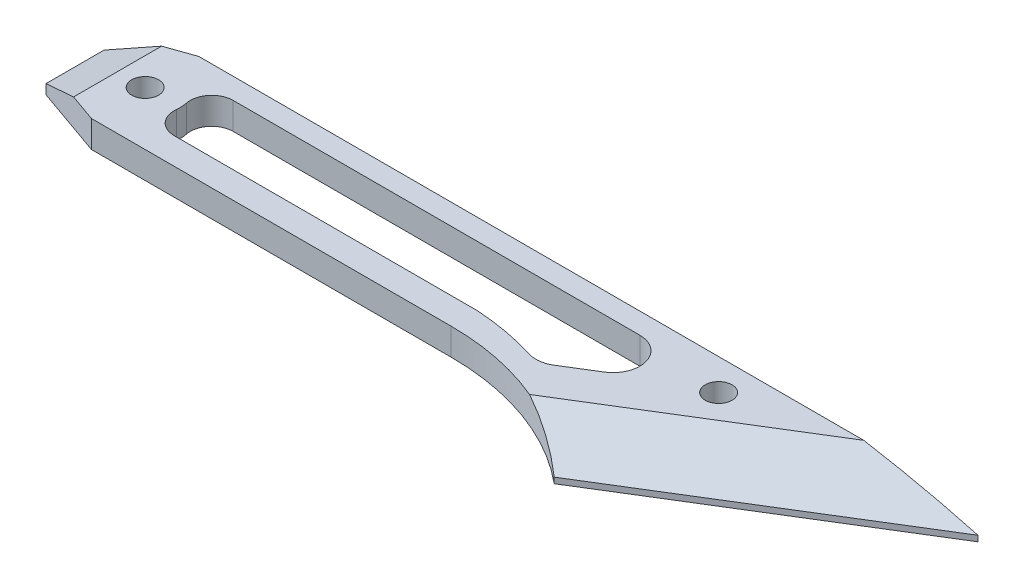
ISO-10303-21;
HEADER;
FILE_DESCRIPTION(('STEP AP214'),'2;1');
FILE_NAME('part.step','',(''),(''),'','','');
FILE_SCHEMA(('AUTOMOTIVE_DESIGN { 1 0 10303 214 1 1 1 1 }'));
ENDSEC;
DATA;
#1=APPLICATION_CONTEXT('core data for automotive mechanical design processes');
#2=APPLICATION_PROTOCOL_DEFINITION('international standard','automotive_design',2000,#1);
#3=PRODUCT_CONTEXT('',#1,'mechanical');
#4=PRODUCT('Part','Part','',(#3));
#5=PRODUCT_RELATED_PRODUCT_CATEGORY('part','',(#4));
#6=PRODUCT_DEFINITION_FORMATION('','',#4);
#7=PRODUCT_DEFINITION_CONTEXT('part definition',#1,'design');
#8=PRODUCT_DEFINITION('design','',#6,#7);
#9=PRODUCT_DEFINITION_SHAPE('','',#8);
#10=(LENGTH_UNIT() NAMED_UNIT(*) SI_UNIT(.MILLI.,.METRE.));
#11=(NAMED_UNIT(*) PLANE_ANGLE_UNIT() SI_UNIT($,.RADIAN.));
#12=(NAMED_UNIT(*) SI_UNIT($,.STERADIAN.) SOLID_ANGLE_UNIT());
#13=UNCERTAINTY_MEASURE_WITH_UNIT(LENGTH_MEASURE(1.E-05),#10,'distance_accuracy_value','');
#14=(GEOMETRIC_REPRESENTATION_CONTEXT(3) GLOBAL_UNCERTAINTY_ASSIGNED_CONTEXT((#13)) GLOBAL_UNIT_ASSIGNED_CONTEXT((#10,
#11,#12)) REPRESENTATION_CONTEXT('',''));
#15=CARTESIAN_POINT('',(0.,0.,0.));
#16=DIRECTION('',(0.,0.,1.));
#17=DIRECTION('',(1.,0.,0.));
#18=AXIS2_PLACEMENT_3D('',#15,#16,#17);
#19=CARTESIAN_POINT('',(50.8,0.,32.8083333333334));
#20=DIRECTION('',(0.,-1.,0.));
#21=DIRECTION('',(0.,0.,-1.));
#22=AXIS2_PLACEMENT_3D('',#19,#20,#21);
#23=PLANE('',#22);
#24=CARTESIAN_POINT('',(8.28992983067394,0.,-3.429));
#25=DIRECTION('',(0.,1.,0.));
#26=DIRECTION('',(0.,0.,1.));
#27=AXIS2_PLACEMENT_3D('',#24,#25,#26);
#28=CIRCLE('',#27,1.5875);
#29=CARTESIAN_POINT('',(8.28992983067394,0.,-1.8415));
#30=VERTEX_POINT('',#29);
#31=EDGE_CURVE('E178',#30,#30,#28,.T.);
#32=ORIENTED_EDGE('',*,*,#31,.T.);
#33=EDGE_LOOP('',(#32));
#34=FACE_BOUND('',#33,.T.);
#35=CARTESIAN_POINT('',(8.28992983067394,0.,-3.429));
#36=DIRECTION('',(0.,-1.,0.));
#37=DIRECTION('',(0.,0.,-1.));
#38=AXIS2_PLACEMENT_3D('',#35,#36,#37);
#39=CIRCLE('',#38,4.1275);
#40=CARTESIAN_POINT('',(12.333339272969,0.,-4.25791274085937));
#41=VERTEX_POINT('',#40);
#42=CARTESIAN_POINT('',(12.3962691287879,0.,-3.01158675300746));
#43=VERTEX_POINT('',#42);
#44=EDGE_CURVE('E211',#41,#43,#39,.T.);
#45=ORIENTED_EDGE('',*,*,#44,.T.);
#46=CARTESIAN_POINT('',(14.9232471583965,0.,-2.75471706255051));
#47=DIRECTION('',(0.,-1.,0.));
#48=DIRECTION('',(0.,0.,-1.));
#49=AXIS2_PLACEMENT_3D('',#46,#47,#48);
#50=CIRCLE('',#49,2.54);
#51=CARTESIAN_POINT('',(14.9232471583965,0.,-0.214717062550514));
#52=VERTEX_POINT('',#51);
#53=EDGE_CURVE('E236',#43,#52,#50,.F.);
#54=ORIENTED_EDGE('',*,*,#53,.T.);
#55=DIRECTION('',(1.,0.,0.));
#56=VECTOR('',#55,1.);
#57=CARTESIAN_POINT('',(14.9232471583965,0.,-0.214717062550514));
#58=LINE('',#57,#56);
#59=CARTESIAN_POINT('',(50.8010780015129,0.,-0.214717062550514));
#60=VERTEX_POINT('',#59);
#61=EDGE_CURVE('E195',#52,#60,#58,.T.);
#62=ORIENTED_EDGE('',*,*,#61,.T.);
#63=CARTESIAN_POINT('',(48.6883260508946,0.,32.330206500448));
#64=DIRECTION('',(0.,-1.,0.));
#65=DIRECTION('',(0.,0.,-1.));
#66=AXIS2_PLACEMENT_3D('',#63,#64,#65);
#67=CIRCLE('',#66,32.6134292972429);
#68=CARTESIAN_POINT('',(58.2813161500645,0.,1.15954222322276));
#69=VERTEX_POINT('',#68);
#70=EDGE_CURVE('E200',#60,#69,#67,.T.);
#71=ORIENTED_EDGE('',*,*,#70,.T.);
#72=CARTESIAN_POINT('',(59.21521804941,0.,-1.875000945427));
#73=DIRECTION('',(0.,-1.,0.));
#74=DIRECTION('',(0.,0.,-1.));
#75=AXIS2_PLACEMENT_3D('',#72,#73,#74);
#76=CIRCLE('',#75,3.175);
#77=CARTESIAN_POINT('',(60.8804338210623,0.,0.828271411151344));
#78=VERTEX_POINT('',#77);
#79=EDGE_CURVE('E322',#69,#78,#76,.F.);
#80=ORIENTED_EDGE('',*,*,#79,.T.);
#81=DIRECTION('',(0.85142436427664,0.,-0.524477408394412));
#82=VECTOR('',#81,1.);
#83=CARTESIAN_POINT('',(59.62129677767,0.,1.60389982988099));
#84=LINE('',#83,#82);
#85=CARTESIAN_POINT('',(64.5460376256946,0.,-1.42974053250218));
#86=VERTEX_POINT('',#85);
#87=EDGE_CURVE('E203',#78,#86,#84,.T.);
#88=ORIENTED_EDGE('',*,*,#87,.T.);
#89=CARTESIAN_POINT('',(62.8808218540424,0.,-4.13301288908052));
#90=DIRECTION('',(0.,-1.,0.));
#91=DIRECTION('',(0.,0.,-1.));
#92=AXIS2_PLACEMENT_3D('',#89,#90,#91);
#93=CIRCLE('',#92,3.175);
#94=CARTESIAN_POINT('',(62.8808218540424,0.,-7.30801288908052));
#95=VERTEX_POINT('',#94);
#96=EDGE_CURVE('E49',#86,#95,#93,.F.);
#97=ORIENTED_EDGE('',*,*,#96,.T.);
#98=DIRECTION('',(-1.,0.,0.));
#99=VECTOR('',#98,1.);
#100=CARTESIAN_POINT('',(74.0886875552049,0.,-7.30801288908052));
#101=LINE('',#100,#99);
#102=CARTESIAN_POINT('',(14.8215912374583,0.,-7.30801288908052));
#103=VERTEX_POINT('',#102);
#104=EDGE_CURVE('E206',#95,#103,#101,.T.);
#105=ORIENTED_EDGE('',*,*,#104,.T.);
#106=CARTESIAN_POINT('',(14.8215912374583,0.,-4.76801288908052));
#107=DIRECTION('',(0.,-1.,0.));
#108=DIRECTION('',(0.,0.,-1.));
#109=AXIS2_PLACEMENT_3D('',#106,#107,#108);
#110=CIRCLE('',#109,2.54);
#111=EDGE_CURVE('E208',#103,#41,#110,.F.);
#112=ORIENTED_EDGE('',*,*,#111,.T.);
#113=EDGE_LOOP('',(#45,#54,#62,#71,#80,#88,#97,#105,#112));
#114=FACE_BOUND('',#113,.T.);
#115=CARTESIAN_POINT('',(73.406,0.,-6.096));
#116=DIRECTION('',(0.,1.,0.));
#117=DIRECTION('',(0.,0.,1.));
#118=AXIS2_PLACEMENT_3D('',#115,#116,#117);
#119=CIRCLE('',#118,1.5875);
#120=CARTESIAN_POINT('',(73.406,0.,-4.5085));
#121=VERTEX_POINT('',#120);
#122=EDGE_CURVE('E192',#121,#121,#119,.T.);
#123=ORIENTED_EDGE('',*,*,#122,.T.);
#124=EDGE_LOOP('',(#123));
#125=FACE_BOUND('',#124,.T.);
#126=DIRECTION('',(-1.,0.,0.));
#127=VECTOR('',#126,1.);
#128=CARTESIAN_POINT('',(8.28992983067394,0.,-9.779));
#129=LINE('',#128,#127);
#130=CARTESIAN_POINT('',(86.8714609375993,0.,-9.779));
#131=VERTEX_POINT('',#130);
#132=CARTESIAN_POINT('',(8.28992983067394,0.,-9.779));
#133=VERTEX_POINT('',#132);
#134=EDGE_CURVE('E280',#131,#133,#129,.T.);
#135=ORIENTED_EDGE('',*,*,#134,.F.);
#136=CARTESIAN_POINT('',(86.8714609375993,0.,199.785908128836));
#137=DIRECTION('',(0.,-1.,0.));
#138=DIRECTION('',(0.,0.,-1.));
#139=AXIS2_PLACEMENT_3D('',#136,#137,#138);
#140=CIRCLE('',#139,209.564908128836);
#141=CARTESIAN_POINT('',(100.843083740158,0.,-9.31273958393734));
#142=VERTEX_POINT('',#141);
#143=EDGE_CURVE('E56',#131,#142,#140,.T.);
#144=ORIENTED_EDGE('',*,*,#143,.T.);
#145=DIRECTION('',(0.85142436427664,0.,-0.524477408394413));
#146=VECTOR('',#145,1.);
#147=CARTESIAN_POINT('',(69.85,0.,9.77900000000004));
#148=LINE('',#147,#146);
#149=CARTESIAN_POINT('',(69.85,0.,9.77900000000004));
#150=VERTEX_POINT('',#149);
#151=EDGE_CURVE('E184',#150,#142,#148,.T.);
#152=ORIENTED_EDGE('',*,*,#151,.F.);
#153=CARTESIAN_POINT('',(50.8,0.,32.8083333333334));
#154=DIRECTION('',(0.,-1.,0.));
#155=DIRECTION('',(0.,0.,-1.));
#156=AXIS2_PLACEMENT_3D('',#153,#154,#155);
#157=CIRCLE('',#156,29.8873333333334);
#158=CARTESIAN_POINT('',(50.8,0.,2.92100000000003));
#159=VERTEX_POINT('',#158);
#160=EDGE_CURVE('E276',#159,#150,#157,.T.);
#161=ORIENTED_EDGE('',*,*,#160,.F.);
#162=DIRECTION('',(1.,0.,0.));
#163=VECTOR('',#162,1.);
#164=CARTESIAN_POINT('',(50.8,0.,2.92100000000003));
#165=LINE('',#164,#163);
#166=CARTESIAN_POINT('',(8.28992983067394,0.,2.921));
#167=VERTEX_POINT('',#166);
#168=EDGE_CURVE('E274',#167,#159,#165,.T.);
#169=ORIENTED_EDGE('',*,*,#168,.F.);
#170=DIRECTION('',(0.943163655254947,0.,0.332328631637613));
#171=VECTOR('',#170,1.);
#172=CARTESIAN_POINT('',(0.,0.,0.));
#173=LINE('',#172,#171);
#174=CARTESIAN_POINT('',(0.,0.,0.));
#175=VERTEX_POINT('',#174);
#176=EDGE_CURVE('E255',#175,#167,#173,.T.);
#177=ORIENTED_EDGE('',*,*,#176,.F.);
#178=DIRECTION('',(0.,0.,1.));
#179=VECTOR('',#178,1.);
#180=CARTESIAN_POINT('',(0.,0.,0.));
#181=LINE('',#180,#179);
#182=CARTESIAN_POINT('',(0.,0.,-6.858));
#183=VERTEX_POINT('',#182);
#184=EDGE_CURVE('E261',#183,#175,#181,.T.);
#185=ORIENTED_EDGE('',*,*,#184,.F.);
#186=DIRECTION('',(-0.943163655254947,0.,0.332328631637613));
#187=VECTOR('',#186,1.);
#188=CARTESIAN_POINT('',(0.,0.,-6.858));
#189=LINE('',#188,#187);
#190=EDGE_CURVE('E282',#133,#183,#189,.T.);
#191=ORIENTED_EDGE('',*,*,#190,.F.);
#192=EDGE_LOOP('',(#135,#144,#152,#161,#169,#177,#185,#191));
#193=FACE_BOUND('',#192,.T.);
#194=ADVANCED_FACE('F41',(#34,#114,#125,#193),#23,.T.);
#195=CARTESIAN_POINT('',(69.85,3.175,9.77900000000004));
#196=DIRECTION('',(-0.524477408394413,0.,-0.85142436427664));
#197=DIRECTION('',(-0.85142436427664,0.,0.524477408394413));
#198=AXIS2_PLACEMENT_3D('',#195,#196,#197);
#199=PLANE('',#198);
#200=DIRECTION('',(0.,-1.,0.));
#201=VECTOR('',#200,1.);
#202=CARTESIAN_POINT('',(100.843083740158,132.567547052805,-9.31273958393736));
#203=LINE('',#202,#201);
#204=CARTESIAN_POINT('',(100.843083740158,0.675804530419932,-9.31273958393736));
#205=VERTEX_POINT('',#204);
#206=EDGE_CURVE('E182',#205,#142,#203,.T.);
#207=ORIENTED_EDGE('',*,*,#206,.F.);
#208=DIRECTION('',(-0.85142436427664,0.,0.524477408394413));
#209=VECTOR('',#208,1.);
#210=CARTESIAN_POINT('',(69.85,0.675804530419943,9.77900000000004));
#211=LINE('',#210,#209);
#212=CARTESIAN_POINT('',(69.85,0.675804530419946,9.77900000000004));
#213=VERTEX_POINT('',#212);
#214=EDGE_CURVE('E170',#205,#213,#211,.T.);
#215=ORIENTED_EDGE('',*,*,#214,.T.);
#216=DIRECTION('',(0.,-1.,0.));
#217=VECTOR('',#216,1.);
#218=CARTESIAN_POINT('',(69.85,3.175,9.77900000000004));
#219=LINE('',#218,#217);
#220=EDGE_CURVE('E293',#213,#150,#219,.T.);
#221=ORIENTED_EDGE('',*,*,#220,.T.);
#222=ORIENTED_EDGE('',*,*,#151,.T.);
#223=EDGE_LOOP('',(#207,#215,#221,#222));
#224=FACE_BOUND('',#223,.T.);
#225=ADVANCED_FACE('F183',(#224),#199,.F.);
#226=CARTESIAN_POINT('',(65.7985242599529,3.175,3.20192899343016));
#227=DIRECTION('',(-0.161444785545511,-0.951444518554411,-0.262085690820633));
#228=DIRECTION('',(0.,0.265569498876491,-0.964091718285397));
#229=AXIS2_PLACEMENT_3D('',#226,#227,#228);
#230=PLANE('',#229);
#231=CARTESIAN_POINT('',(86.8714609375993,-54.5519222194457,199.785908128836));
#232=DIRECTION('',(-0.161444785545511,-0.951444518554411,-0.262085690820633));
#233=DIRECTION('',(0.499011155322487,-0.307820285414663,0.810083044354683));
#234=AXIS2_PLACEMENT_3D('',#231,#232,#233);
#235=ELLIPSE('',#234,220.259725125371,209.564908128836);
#236=CARTESIAN_POINT('',(86.8714609375993,3.17499999999999,-9.77900000000002));
#237=VERTEX_POINT('',#236);
#238=EDGE_CURVE('E13',#237,#205,#235,.T.);
#239=ORIENTED_EDGE('',*,*,#238,.F.);
#240=DIRECTION('',(0.85142436427664,0.,-0.524477408394413));
#241=VECTOR('',#240,1.);
#242=CARTESIAN_POINT('',(65.7985242599529,3.175,3.20192899343016));
#243=LINE('',#242,#241);
#244=CARTESIAN_POINT('',(62.43031779899,3.175,5.27674417338337));
#245=VERTEX_POINT('',#244);
#246=EDGE_CURVE('E179',#245,#237,#243,.T.);
#247=ORIENTED_EDGE('',*,*,#246,.F.);
#248=CARTESIAN_POINT('',(50.8,-2.43539692530007,32.8083333333334));
#249=DIRECTION('',(-0.161444785545511,-0.951444518554411,-0.262085690820633));
#250=DIRECTION('',(0.499011155322489,-0.307820285414663,0.810083044354683));
#251=AXIS2_PLACEMENT_3D('',#248,#249,#250);
#252=ELLIPSE('',#251,31.4125865991041,29.8873333333334);
#253=EDGE_CURVE('E175',#245,#213,#252,.T.);
#254=ORIENTED_EDGE('',*,*,#253,.T.);
#255=ORIENTED_EDGE('',*,*,#214,.F.);
#256=EDGE_LOOP('',(#239,#247,#254,#255));
#257=FACE_BOUND('',#256,.T.);
#258=ADVANCED_FACE('F172',(#257),#230,.F.);
#259=CARTESIAN_POINT('',(50.8,3.175,32.8083333333334));
#260=DIRECTION('',(0.,-1.,0.));
#261=DIRECTION('',(0.,0.,-1.));
#262=AXIS2_PLACEMENT_3D('',#259,#260,#261);
#263=PLANE('',#262);
#264=CARTESIAN_POINT('',(73.406,3.175,-6.096));
#265=DIRECTION('',(0.,1.,0.));
#266=DIRECTION('',(0.,0.,1.));
#267=AXIS2_PLACEMENT_3D('',#264,#265,#266);
#268=CIRCLE('',#267,1.5875);
#269=CARTESIAN_POINT('',(73.406,3.175,-4.5085));
#270=VERTEX_POINT('',#269);
#271=EDGE_CURVE('E191',#270,#270,#268,.T.);
#272=ORIENTED_EDGE('',*,*,#271,.F.);
#273=EDGE_LOOP('',(#272));
#274=FACE_BOUND('',#273,.T.);
#275=CARTESIAN_POINT('',(14.9232471583965,3.175,-2.75471706255051));
#276=DIRECTION('',(0.,1.,0.));
#277=DIRECTION('',(0.,0.,1.));
#278=AXIS2_PLACEMENT_3D('',#275,#276,#277);
#279=CIRCLE('',#278,2.54);
#280=CARTESIAN_POINT('',(12.3962691287879,3.175,-3.01158675300746));
#281=VERTEX_POINT('',#280);
#282=CARTESIAN_POINT('',(14.9232471583965,3.175,-0.214717062550514));
#283=VERTEX_POINT('',#282);
#284=EDGE_CURVE('E216',#281,#283,#279,.T.);
#285=ORIENTED_EDGE('',*,*,#284,.F.);
#286=CARTESIAN_POINT('',(8.28992983067394,3.175,-3.429));
#287=DIRECTION('',(0.,-1.,0.));
#288=DIRECTION('',(0.,0.,1.));
#289=AXIS2_PLACEMENT_3D('',#286,#287,#288);
#290=CIRCLE('',#289,4.1275);
#291=CARTESIAN_POINT('',(12.333339272969,3.175,-4.25791274085937));
#292=VERTEX_POINT('',#291);
#293=EDGE_CURVE('E214',#292,#281,#290,.T.);
#294=ORIENTED_EDGE('',*,*,#293,.F.);
#295=CARTESIAN_POINT('',(14.8215912374583,3.175,-4.76801288908052));
#296=DIRECTION('',(0.,1.,0.));
#297=DIRECTION('',(0.,0.,-1.));
#298=AXIS2_PLACEMENT_3D('',#295,#296,#297);
#299=CIRCLE('',#298,2.54);
#300=CARTESIAN_POINT('',(14.8215912374583,3.175,-7.30801288908052));
#301=VERTEX_POINT('',#300);
#302=EDGE_CURVE('E230',#301,#292,#299,.T.);
#303=ORIENTED_EDGE('',*,*,#302,.F.);
#304=DIRECTION('',(-1.,0.,0.));
#305=VECTOR('',#304,1.);
#306=CARTESIAN_POINT('',(74.0886875552049,3.175,-7.30801288908052));
#307=LINE('',#306,#305);
#308=CARTESIAN_POINT('',(62.8808218540424,3.175,-7.30801288908052));
#309=VERTEX_POINT('',#308);
#310=EDGE_CURVE('E228',#309,#301,#307,.T.);
#311=ORIENTED_EDGE('',*,*,#310,.F.);
#312=CARTESIAN_POINT('',(62.8808218540424,3.175,-4.13301288908052));
#313=DIRECTION('',(0.,-1.,0.));
#314=DIRECTION('',(0.,0.,-1.));
#315=AXIS2_PLACEMENT_3D('',#312,#313,#314);
#316=CIRCLE('',#315,3.175);
#317=CARTESIAN_POINT('',(64.5460376256946,3.175,-1.42974053250218));
#318=VERTEX_POINT('',#317);
#319=EDGE_CURVE('E324',#309,#318,#316,.T.);
#320=ORIENTED_EDGE('',*,*,#319,.T.);
#321=DIRECTION('',(0.85142436427664,0.,-0.524477408394412));
#322=VECTOR('',#321,1.);
#323=CARTESIAN_POINT('',(59.62129677767,3.175,1.60389982988099));
#324=LINE('',#323,#322);
#325=CARTESIAN_POINT('',(60.8804338210623,3.175,0.828271411151344));
#326=VERTEX_POINT('',#325);
#327=EDGE_CURVE('E225',#326,#318,#324,.T.);
#328=ORIENTED_EDGE('',*,*,#327,.F.);
#329=CARTESIAN_POINT('',(59.21521804941,3.175,-1.875000945427));
#330=DIRECTION('',(0.,-1.,0.));
#331=DIRECTION('',(0.,0.,-1.));
#332=AXIS2_PLACEMENT_3D('',#329,#330,#331);
#333=CIRCLE('',#332,3.175);
#334=CARTESIAN_POINT('',(58.2813161500645,3.175,1.15954222322276));
#335=VERTEX_POINT('',#334);
#336=EDGE_CURVE('E320',#326,#335,#333,.T.);
#337=ORIENTED_EDGE('',*,*,#336,.T.);
#338=CARTESIAN_POINT('',(48.6883260508946,3.175,32.330206500448));
#339=DIRECTION('',(0.,-1.,0.));
#340=DIRECTION('',(0.,0.,1.));
#341=AXIS2_PLACEMENT_3D('',#338,#339,#340);
#342=CIRCLE('',#341,32.6134292972429);
#343=CARTESIAN_POINT('',(50.8010780015129,3.175,-0.214717062550523));
#344=VERTEX_POINT('',#343);
#345=EDGE_CURVE('E222',#344,#335,#342,.T.);
#346=ORIENTED_EDGE('',*,*,#345,.F.);
#347=DIRECTION('',(1.,0.,0.));
#348=VECTOR('',#347,1.);
#349=CARTESIAN_POINT('',(14.9232471583965,3.175,-0.214717062550514));
#350=LINE('',#349,#348);
#351=EDGE_CURVE('E219',#283,#344,#350,.T.);
#352=ORIENTED_EDGE('',*,*,#351,.F.);
#353=EDGE_LOOP('',(#285,#294,#303,#311,#320,#328,#337,#346,#352));
#354=FACE_BOUND('',#353,.T.);
#355=CARTESIAN_POINT('',(8.28992983067394,3.175,-3.429));
#356=DIRECTION('',(0.,1.,0.));
#357=DIRECTION('',(0.,0.,1.));
#358=AXIS2_PLACEMENT_3D('',#355,#356,#357);
#359=CIRCLE('',#358,1.5875);
#360=CARTESIAN_POINT('',(8.28992983067394,3.175,-1.8415));
#361=VERTEX_POINT('',#360);
#362=EDGE_CURVE('E252',#361,#361,#359,.T.);
#363=ORIENTED_EDGE('',*,*,#362,.F.);
#364=EDGE_LOOP('',(#363));
#365=FACE_BOUND('',#364,.T.);
#366=CARTESIAN_POINT('',(50.8,3.175,32.8083333333334));
#367=DIRECTION('',(0.,-1.,0.));
#368=DIRECTION('',(0.,0.,-1.));
#369=AXIS2_PLACEMENT_3D('',#366,#367,#368);
#370=CIRCLE('',#369,29.8873333333334);
#371=CARTESIAN_POINT('',(50.8,3.175,2.92100000000003));
#372=VERTEX_POINT('',#371);
#373=EDGE_CURVE('E263',#372,#245,#370,.T.);
#374=ORIENTED_EDGE('',*,*,#373,.T.);
#375=ORIENTED_EDGE('',*,*,#246,.T.);
#376=DIRECTION('',(-1.,0.,0.));
#377=VECTOR('',#376,1.);
#378=CARTESIAN_POINT('',(8.28992983067394,3.175,-9.779));
#379=LINE('',#378,#377);
#380=CARTESIAN_POINT('',(8.28992983067394,3.175,-9.779));
#381=VERTEX_POINT('',#380);
#382=EDGE_CURVE('E266',#237,#381,#379,.T.);
#383=ORIENTED_EDGE('',*,*,#382,.T.);
#384=DIRECTION('',(-0.943163655254947,0.,0.332328631637613));
#385=VECTOR('',#384,1.);
#386=CARTESIAN_POINT('',(0.,3.175,-6.858));
#387=LINE('',#386,#385);
#388=CARTESIAN_POINT('',(5.0293764861419,3.175,-8.63012702834497));
#389=VERTEX_POINT('',#388);
#390=EDGE_CURVE('E268',#381,#389,#387,.T.);
#391=ORIENTED_EDGE('',*,*,#390,.T.);
#392=DIRECTION('',(0.,0.,1.));
#393=VECTOR('',#392,1.);
#394=CARTESIAN_POINT('',(5.02937648614191,3.175,32.8083333333334));
#395=LINE('',#394,#393);
#396=CARTESIAN_POINT('',(5.0293764861419,3.175,1.77212702834496));
#397=VERTEX_POINT('',#396);
#398=EDGE_CURVE('E301',#389,#397,#395,.T.);
#399=ORIENTED_EDGE('',*,*,#398,.T.);
#400=DIRECTION('',(0.943163655254947,0.,0.332328631637613));
#401=VECTOR('',#400,1.);
#402=CARTESIAN_POINT('',(0.,3.175,0.));
#403=LINE('',#402,#401);
#404=CARTESIAN_POINT('',(8.28992983067394,3.175,2.921));
#405=VERTEX_POINT('',#404);
#406=EDGE_CURVE('E258',#397,#405,#403,.T.);
#407=ORIENTED_EDGE('',*,*,#406,.T.);
#408=DIRECTION('',(1.,0.,0.));
#409=VECTOR('',#408,1.);
#410=CARTESIAN_POINT('',(50.8,3.175,2.92100000000003));
#411=LINE('',#410,#409);
#412=EDGE_CURVE('E260',#405,#372,#411,.T.);
#413=ORIENTED_EDGE('',*,*,#412,.T.);
#414=EDGE_LOOP('',(#374,#375,#383,#391,#399,#407,#413));
#415=FACE_BOUND('',#414,.T.);
#416=ADVANCED_FACE('F341',(#274,#354,#365,#415),#263,.F.);
#417=CARTESIAN_POINT('',(50.8,3.175,32.8083333333334));
#418=DIRECTION('',(0.,-1.,0.));
#419=DIRECTION('',(0.,0.,-1.));
#420=AXIS2_PLACEMENT_3D('',#417,#418,#419);
#421=CYLINDRICAL_SURFACE('',#420,29.8873333333334);
#422=ORIENTED_EDGE('',*,*,#220,.F.);
#423=ORIENTED_EDGE('',*,*,#253,.F.);
#424=ORIENTED_EDGE('',*,*,#373,.F.);
#425=DIRECTION('',(0.,-1.,0.));
#426=VECTOR('',#425,1.);
#427=CARTESIAN_POINT('',(50.8,3.175,2.92100000000003));
#428=LINE('',#427,#426);
#429=EDGE_CURVE('E295',#372,#159,#428,.T.);
#430=ORIENTED_EDGE('',*,*,#429,.T.);
#431=ORIENTED_EDGE('',*,*,#160,.T.);
#432=EDGE_LOOP('',(#422,#423,#424,#430,#431));
#433=FACE_BOUND('',#432,.T.);
#434=ADVANCED_FACE('F401',(#433),#421,.F.);
#435=CARTESIAN_POINT('',(0.,3.175,0.));
#436=DIRECTION('',(0.332328631637613,0.,-0.943163655254947));
#437=DIRECTION('',(-0.943163655254947,0.,-0.332328631637613));
#438=AXIS2_PLACEMENT_3D('',#435,#436,#437);
#439=PLANE('',#438);
#440=ORIENTED_EDGE('',*,*,#406,.F.);
#441=DIRECTION('',(0.881342473762532,0.356085473342498,0.310545615999631));
#442=VECTOR('',#441,1.);
#443=CARTESIAN_POINT('',(13.523894328756,6.60700798424077,4.76521468108551));
#444=LINE('',#443,#442);
#445=CARTESIAN_POINT('',(0.,1.14299999999999,0.));
#446=VERTEX_POINT('',#445);
#447=EDGE_CURVE('E304',#397,#446,#444,.F.);
#448=ORIENTED_EDGE('',*,*,#447,.T.);
#449=DIRECTION('',(0.,-1.,0.));
#450=VECTOR('',#449,1.);
#451=CARTESIAN_POINT('',(0.,3.175,0.));
#452=LINE('',#451,#450);
#453=EDGE_CURVE('E271',#446,#175,#452,.T.);
#454=ORIENTED_EDGE('',*,*,#453,.T.);
#455=ORIENTED_EDGE('',*,*,#176,.T.);
#456=DIRECTION('',(0.,-1.,0.));
#457=VECTOR('',#456,1.);
#458=CARTESIAN_POINT('',(8.28992983067394,3.175,2.921));
#459=LINE('',#458,#457);
#460=EDGE_CURVE('E298',#405,#167,#459,.T.);
#461=ORIENTED_EDGE('',*,*,#460,.F.);
#462=EDGE_LOOP('',(#440,#448,#454,#455,#461));
#463=FACE_BOUND('',#462,.T.);
#464=ADVANCED_FACE('F404',(#463),#439,.F.);
#465=CARTESIAN_POINT('',(50.8,3.175,2.92100000000003));
#466=DIRECTION('',(0.,0.,-1.));
#467=DIRECTION('',(-1.,0.,0.));
#468=AXIS2_PLACEMENT_3D('',#465,#466,#467);
#469=PLANE('',#468);
#470=ORIENTED_EDGE('',*,*,#168,.T.);
#471=ORIENTED_EDGE('',*,*,#429,.F.);
#472=ORIENTED_EDGE('',*,*,#412,.F.);
#473=ORIENTED_EDGE('',*,*,#460,.T.);
#474=EDGE_LOOP('',(#470,#471,#472,#473));
#475=FACE_BOUND('',#474,.T.);
#476=ADVANCED_FACE('F399',(#475),#469,.F.);
#477=CARTESIAN_POINT('',(8.28992983067394,3.175,-9.779));
#478=DIRECTION('',(0.,0.,1.));
#479=DIRECTION('',(1.,0.,0.));
#480=AXIS2_PLACEMENT_3D('',#477,#478,#479);
#481=PLANE('',#480);
#482=ORIENTED_EDGE('',*,*,#382,.F.);
#483=DIRECTION('',(0.,-1.,0.));
#484=VECTOR('',#483,1.);
#485=CARTESIAN_POINT('',(86.8714609375993,132.567547052805,-9.77900000000002));
#486=LINE('',#485,#484);
#487=EDGE_CURVE('E64',#237,#131,#486,.T.);
#488=ORIENTED_EDGE('',*,*,#487,.T.);
#489=ORIENTED_EDGE('',*,*,#134,.T.);
#490=DIRECTION('',(0.,-1.,0.));
#491=VECTOR('',#490,1.);
#492=CARTESIAN_POINT('',(8.28992983067394,3.175,-9.779));
#493=LINE('',#492,#491);
#494=EDGE_CURVE('E290',#381,#133,#493,.T.);
#495=ORIENTED_EDGE('',*,*,#494,.F.);
#496=EDGE_LOOP('',(#482,#488,#489,#495));
#497=FACE_BOUND('',#496,.T.);
#498=ADVANCED_FACE('F396',(#497),#481,.F.);
#499=CARTESIAN_POINT('',(0.,3.175,-6.858));
#500=DIRECTION('',(0.332328631637613,0.,0.943163655254947));
#501=DIRECTION('',(0.943163655254947,0.,-0.332328631637613));
#502=AXIS2_PLACEMENT_3D('',#499,#500,#501);
#503=PLANE('',#502);
#504=DIRECTION('',(0.,-1.,0.));
#505=VECTOR('',#504,1.);
#506=CARTESIAN_POINT('',(0.,3.175,-6.858));
#507=LINE('',#506,#505);
#508=CARTESIAN_POINT('',(0.,1.14299999999999,-6.858));
#509=VERTEX_POINT('',#508);
#510=EDGE_CURVE('E288',#509,#183,#507,.T.);
#511=ORIENTED_EDGE('',*,*,#510,.F.);
#512=DIRECTION('',(-0.881342473762532,-0.356085473342498,0.310545615999631));
#513=VECTOR('',#512,1.);
#514=CARTESIAN_POINT('',(-6.31220751590011,-1.40729737933745,-4.63386076956634));
#515=LINE('',#514,#513);
#516=EDGE_CURVE('E308',#509,#389,#515,.F.);
#517=ORIENTED_EDGE('',*,*,#516,.T.);
#518=ORIENTED_EDGE('',*,*,#390,.F.);
#519=ORIENTED_EDGE('',*,*,#494,.T.);
#520=ORIENTED_EDGE('',*,*,#190,.T.);
#521=EDGE_LOOP('',(#511,#517,#518,#519,#520));
#522=FACE_BOUND('',#521,.T.);
#523=ADVANCED_FACE('F392',(#522),#503,.F.);
#524=CARTESIAN_POINT('',(0.,3.175,0.));
#525=DIRECTION('',(1.,0.,0.));
#526=DIRECTION('',(0.,0.,-1.));
#527=AXIS2_PLACEMENT_3D('',#524,#525,#526);
#528=PLANE('',#527);
#529=ORIENTED_EDGE('',*,*,#453,.F.);
#530=DIRECTION('',(0.,0.,-1.));
#531=VECTOR('',#530,1.);
#532=CARTESIAN_POINT('',(0.,1.14299999999999,0.));
#533=LINE('',#532,#531);
#534=EDGE_CURVE('E306',#446,#509,#533,.T.);
#535=ORIENTED_EDGE('',*,*,#534,.T.);
#536=ORIENTED_EDGE('',*,*,#510,.T.);
#537=ORIENTED_EDGE('',*,*,#184,.T.);
#538=EDGE_LOOP('',(#529,#535,#536,#537));
#539=FACE_BOUND('',#538,.T.);
#540=ADVANCED_FACE('F388',(#539),#528,.F.);
#541=CARTESIAN_POINT('',(8.28992983067394,3.175,-3.429));
#542=DIRECTION('',(0.,-1.,0.));
#543=DIRECTION('',(0.,0.,-1.));
#544=AXIS2_PLACEMENT_3D('',#541,#542,#543);
#545=CYLINDRICAL_SURFACE('',#544,1.5875);
#546=ORIENTED_EDGE('',*,*,#362,.T.);
#547=EDGE_LOOP('',(#546));
#548=FACE_BOUND('',#547,.T.);
#549=ORIENTED_EDGE('',*,*,#31,.F.);
#550=EDGE_LOOP('',(#549));
#551=FACE_BOUND('',#550,.T.);
#552=ADVANCED_FACE('F391',(#548,#551),#545,.F.);
#553=CARTESIAN_POINT('',(5.02937648614191,3.175,32.8083333333334));
#554=DIRECTION('',(0.374606593415913,-0.927183854566787,0.));
#555=DIRECTION('',(0.,0.,1.));
#556=AXIS2_PLACEMENT_3D('',#553,#554,#555);
#557=PLANE('',#556);
#558=ORIENTED_EDGE('',*,*,#516,.F.);
#559=ORIENTED_EDGE('',*,*,#534,.F.);
#560=ORIENTED_EDGE('',*,*,#447,.F.);
#561=ORIENTED_EDGE('',*,*,#398,.F.);
#562=EDGE_LOOP('',(#558,#559,#560,#561));
#563=FACE_BOUND('',#562,.T.);
#564=ADVANCED_FACE('F375',(#563),#557,.F.);
#565=CARTESIAN_POINT('',(8.28992983067394,-0.00100000000000013,-3.429));
#566=DIRECTION('',(0.,1.,0.));
#567=DIRECTION('',(0.,0.,1.));
#568=AXIS2_PLACEMENT_3D('',#565,#566,#567);
#569=CYLINDRICAL_SURFACE('',#568,4.1275);
#570=DIRECTION('',(0.,1.,0.));
#571=VECTOR('',#570,1.);
#572=CARTESIAN_POINT('',(12.333339272969,-0.00100000000000013,-4.25791274085937));
#573=LINE('',#572,#571);
#574=EDGE_CURVE('E234',#41,#292,#573,.T.);
#575=ORIENTED_EDGE('',*,*,#574,.T.);
#576=ORIENTED_EDGE('',*,*,#293,.T.);
#577=DIRECTION('',(0.,1.,0.));
#578=VECTOR('',#577,1.);
#579=CARTESIAN_POINT('',(12.3962691287879,-0.00100000000000013,-3.01158675300746));
#580=LINE('',#579,#578);
#581=EDGE_CURVE('E233',#43,#281,#580,.T.);
#582=ORIENTED_EDGE('',*,*,#581,.F.);
#583=ORIENTED_EDGE('',*,*,#44,.F.);
#584=EDGE_LOOP('',(#575,#576,#582,#583));
#585=FACE_BOUND('',#584,.T.);
#586=ADVANCED_FACE('F364',(#585),#569,.T.);
#587=CARTESIAN_POINT('',(14.8215912374583,-0.00100000000000013,-4.76801288908052));
#588=DIRECTION('',(0.,1.,0.));
#589=DIRECTION('',(0.,0.,1.));
#590=AXIS2_PLACEMENT_3D('',#587,#588,#589);
#591=CYLINDRICAL_SURFACE('',#590,2.54);
#592=DIRECTION('',(0.,1.,0.));
#593=VECTOR('',#592,1.);
#594=CARTESIAN_POINT('',(14.8215912374583,-0.00100000000000013,-7.30801288908052));
#595=LINE('',#594,#593);
#596=EDGE_CURVE('E237',#103,#301,#595,.T.);
#597=ORIENTED_EDGE('',*,*,#596,.T.);
#598=ORIENTED_EDGE('',*,*,#302,.T.);
#599=ORIENTED_EDGE('',*,*,#574,.F.);
#600=ORIENTED_EDGE('',*,*,#111,.F.);
#601=EDGE_LOOP('',(#597,#598,#599,#600));
#602=FACE_BOUND('',#601,.T.);
#603=ADVANCED_FACE('F367',(#602),#591,.F.);
#604=CARTESIAN_POINT('',(74.0886875552049,-0.00100000000000013,-7.30801288908052));
#605=DIRECTION('',(0.,0.,-1.));
#606=DIRECTION('',(-1.,0.,0.));
#607=AXIS2_PLACEMENT_3D('',#604,#605,#606);
#608=PLANE('',#607);
#609=ORIENTED_EDGE('',*,*,#104,.F.);
#610=DIRECTION('',(0.,1.,0.));
#611=VECTOR('',#610,1.);
#612=CARTESIAN_POINT('',(62.8808218540424,3.175,-7.30801288908052));
#613=LINE('',#612,#611);
#614=EDGE_CURVE('E317',#95,#309,#613,.T.);
#615=ORIENTED_EDGE('',*,*,#614,.T.);
#616=ORIENTED_EDGE('',*,*,#310,.T.);
#617=ORIENTED_EDGE('',*,*,#596,.F.);
#618=EDGE_LOOP('',(#609,#615,#616,#617));
#619=FACE_BOUND('',#618,.T.);
#620=ADVANCED_FACE('F336',(#619),#608,.F.);
#621=CARTESIAN_POINT('',(59.62129677767,-0.00100000000000013,1.60389982988099));
#622=DIRECTION('',(0.524477408394412,0.,0.85142436427664));
#623=DIRECTION('',(0.85142436427664,0.,-0.524477408394412));
#624=AXIS2_PLACEMENT_3D('',#621,#622,#623);
#625=PLANE('',#624);
#626=ORIENTED_EDGE('',*,*,#87,.F.);
#627=DIRECTION('',(0.,-1.,0.));
#628=VECTOR('',#627,1.);
#629=CARTESIAN_POINT('',(60.8804338210623,3.175,0.828271411151344));
#630=LINE('',#629,#628);
#631=EDGE_CURVE('E312',#78,#326,#630,.F.);
#632=ORIENTED_EDGE('',*,*,#631,.T.);
#633=ORIENTED_EDGE('',*,*,#327,.T.);
#634=DIRECTION('',(0.,1.,0.));
#635=VECTOR('',#634,1.);
#636=CARTESIAN_POINT('',(64.5460376256946,0.,-1.42974053250218));
#637=LINE('',#636,#635);
#638=EDGE_CURVE('E310',#318,#86,#637,.F.);
#639=ORIENTED_EDGE('',*,*,#638,.T.);
#640=EDGE_LOOP('',(#626,#632,#633,#639));
#641=FACE_BOUND('',#640,.T.);
#642=ADVANCED_FACE('F345',(#641),#625,.F.);
#643=CARTESIAN_POINT('',(48.6883260508946,-0.00100000000000013,32.330206500448));
#644=DIRECTION('',(0.,1.,0.));
#645=DIRECTION('',(0.,0.,1.));
#646=AXIS2_PLACEMENT_3D('',#643,#644,#645);
#647=CYLINDRICAL_SURFACE('',#646,32.6134292972429);
#648=ORIENTED_EDGE('',*,*,#345,.T.);
#649=DIRECTION('',(0.,1.,0.));
#650=VECTOR('',#649,1.);
#651=CARTESIAN_POINT('',(58.2813161500645,-0.00100000000000013,1.15954222322276));
#652=LINE('',#651,#650);
#653=EDGE_CURVE('E315',#335,#69,#652,.F.);
#654=ORIENTED_EDGE('',*,*,#653,.T.);
#655=ORIENTED_EDGE('',*,*,#70,.F.);
#656=DIRECTION('',(0.,1.,0.));
#657=VECTOR('',#656,1.);
#658=CARTESIAN_POINT('',(50.8010780015129,-0.00100000000000013,-0.214717062550523));
#659=LINE('',#658,#657);
#660=EDGE_CURVE('E240',#60,#344,#659,.T.);
#661=ORIENTED_EDGE('',*,*,#660,.T.);
#662=EDGE_LOOP('',(#648,#654,#655,#661));
#663=FACE_BOUND('',#662,.T.);
#664=ADVANCED_FACE('F354',(#663),#647,.T.);
#665=CARTESIAN_POINT('',(14.9232471583965,-0.00100000000000013,-0.214717062550514));
#666=DIRECTION('',(0.,0.,1.));
#667=DIRECTION('',(1.,0.,0.));
#668=AXIS2_PLACEMENT_3D('',#665,#666,#667);
#669=PLANE('',#668);
#670=DIRECTION('',(0.,1.,0.));
#671=VECTOR('',#670,1.);
#672=CARTESIAN_POINT('',(14.9232471583965,-0.00100000000000013,-0.214717062550514));
#673=LINE('',#672,#671);
#674=EDGE_CURVE('E242',#52,#283,#673,.T.);
#675=ORIENTED_EDGE('',*,*,#674,.T.);
#676=ORIENTED_EDGE('',*,*,#351,.T.);
#677=ORIENTED_EDGE('',*,*,#660,.F.);
#678=ORIENTED_EDGE('',*,*,#61,.F.);
#679=EDGE_LOOP('',(#675,#676,#677,#678));
#680=FACE_BOUND('',#679,.T.);
#681=ADVANCED_FACE('F358',(#680),#669,.F.);
#682=CARTESIAN_POINT('',(14.9232471583965,-0.00100000000000013,-2.75471706255051));
#683=DIRECTION('',(0.,1.,0.));
#684=DIRECTION('',(0.,0.,1.));
#685=AXIS2_PLACEMENT_3D('',#682,#683,#684);
#686=CYLINDRICAL_SURFACE('',#685,2.54);
#687=ORIENTED_EDGE('',*,*,#581,.T.);
#688=ORIENTED_EDGE('',*,*,#284,.T.);
#689=ORIENTED_EDGE('',*,*,#674,.F.);
#690=ORIENTED_EDGE('',*,*,#53,.F.);
#691=EDGE_LOOP('',(#687,#688,#689,#690));
#692=FACE_BOUND('',#691,.T.);
#693=ADVANCED_FACE('F361',(#692),#686,.F.);
#694=CARTESIAN_POINT('',(59.21521804941,-0.00100000000000013,-1.875000945427));
#695=DIRECTION('',(0.,1.,0.));
#696=DIRECTION('',(0.,0.,1.));
#697=AXIS2_PLACEMENT_3D('',#694,#695,#696);
#698=CYLINDRICAL_SURFACE('',#697,3.175);
#699=ORIENTED_EDGE('',*,*,#79,.F.);
#700=ORIENTED_EDGE('',*,*,#653,.F.);
#701=ORIENTED_EDGE('',*,*,#336,.F.);
#702=ORIENTED_EDGE('',*,*,#631,.F.);
#703=EDGE_LOOP('',(#699,#700,#701,#702));
#704=FACE_BOUND('',#703,.T.);
#705=ADVANCED_FACE('F349',(#704),#698,.F.);
#706=CARTESIAN_POINT('',(62.8808218540424,-0.00100000000000013,-4.13301288908052));
#707=DIRECTION('',(0.,-1.,0.));
#708=DIRECTION('',(0.,0.,-1.));
#709=AXIS2_PLACEMENT_3D('',#706,#707,#708);
#710=CYLINDRICAL_SURFACE('',#709,3.175);
#711=ORIENTED_EDGE('',*,*,#96,.F.);
#712=ORIENTED_EDGE('',*,*,#638,.F.);
#713=ORIENTED_EDGE('',*,*,#319,.F.);
#714=ORIENTED_EDGE('',*,*,#614,.F.);
#715=EDGE_LOOP('',(#711,#712,#713,#714));
#716=FACE_BOUND('',#715,.T.);
#717=ADVANCED_FACE('F43',(#716),#710,.F.);
#718=CARTESIAN_POINT('',(73.406,0.,-6.096));
#719=DIRECTION('',(0.,1.,0.));
#720=DIRECTION('',(0.,0.,1.));
#721=AXIS2_PLACEMENT_3D('',#718,#719,#720);
#722=CYLINDRICAL_SURFACE('',#721,1.5875);
#723=ORIENTED_EDGE('',*,*,#122,.F.);
#724=EDGE_LOOP('',(#723));
#725=FACE_BOUND('',#724,.T.);
#726=ORIENTED_EDGE('',*,*,#271,.T.);
#727=EDGE_LOOP('',(#726));
#728=FACE_BOUND('',#727,.T.);
#729=ADVANCED_FACE('F419',(#725,#728),#722,.F.);
#730=CARTESIAN_POINT('',(86.8714609375993,132.567547052805,199.785908128836));
#731=DIRECTION('',(0.,-1.,0.));
#732=DIRECTION('',(0.,0.,-1.));
#733=AXIS2_PLACEMENT_3D('',#730,#731,#732);
#734=CYLINDRICAL_SURFACE('',#733,209.564908128836);
#735=ORIENTED_EDGE('',*,*,#143,.F.);
#736=ORIENTED_EDGE('',*,*,#487,.F.);
#737=ORIENTED_EDGE('',*,*,#238,.T.);
#738=ORIENTED_EDGE('',*,*,#206,.T.);
#739=EDGE_LOOP('',(#735,#736,#737,#738));
#740=FACE_BOUND('',#739,.T.);
#741=ADVANCED_FACE('F187',(#740),#734,.T.);
#742=CLOSED_SHELL('',(#194,#225,#258,#416,#434,#464,#476,#498,#523,#540,#552,#564,#586,#603,
#620,#642,#664,#681,#693,#705,#717,#729,#741));
#743=MANIFOLD_SOLID_BREP('B2',#742);
#744=ADVANCED_BREP_SHAPE_REPRESENTATION('',(#18,#743),#14);
#745=SHAPE_DEFINITION_REPRESENTATION(#9,#744);
ENDSEC;
END-ISO-10303-21;
